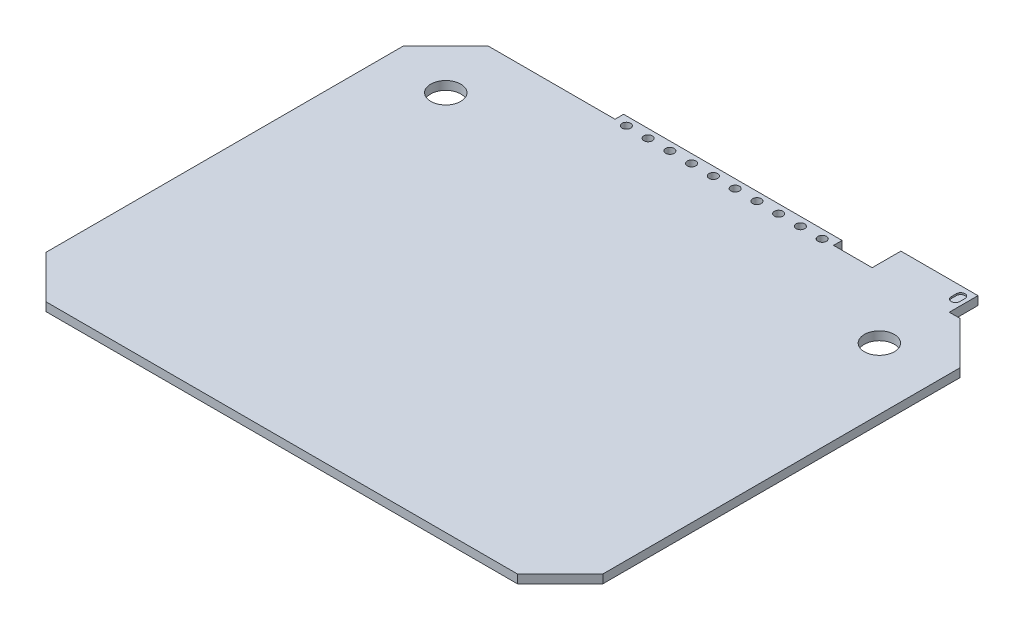
ISO-10303-21;
HEADER;
FILE_DESCRIPTION(('STEP AP214'),'2;1');
FILE_NAME('part.step','',(''),(''),'','','');
FILE_SCHEMA(('AUTOMOTIVE_DESIGN { 1 0 10303 214 1 1 1 1 }'));
ENDSEC;
DATA;
#1=APPLICATION_CONTEXT('core data for automotive mechanical design processes');
#2=APPLICATION_PROTOCOL_DEFINITION('international standard','automotive_design',2000,#1);
#3=PRODUCT_CONTEXT('',#1,'mechanical');
#4=PRODUCT('Part','Part','',(#3));
#5=PRODUCT_RELATED_PRODUCT_CATEGORY('part','',(#4));
#6=PRODUCT_DEFINITION_FORMATION('','',#4);
#7=PRODUCT_DEFINITION_CONTEXT('part definition',#1,'design');
#8=PRODUCT_DEFINITION('design','',#6,#7);
#9=PRODUCT_DEFINITION_SHAPE('','',#8);
#10=(LENGTH_UNIT() NAMED_UNIT(*) SI_UNIT(.MILLI.,.METRE.));
#11=(NAMED_UNIT(*) PLANE_ANGLE_UNIT() SI_UNIT($,.RADIAN.));
#12=(NAMED_UNIT(*) SI_UNIT($,.STERADIAN.) SOLID_ANGLE_UNIT());
#13=UNCERTAINTY_MEASURE_WITH_UNIT(LENGTH_MEASURE(1.E-05),#10,'distance_accuracy_value','');
#14=(GEOMETRIC_REPRESENTATION_CONTEXT(3) GLOBAL_UNCERTAINTY_ASSIGNED_CONTEXT((#13)) GLOBAL_UNIT_ASSIGNED_CONTEXT((#10,
#11,#12)) REPRESENTATION_CONTEXT('',''));
#15=CARTESIAN_POINT('',(0.,0.,0.));
#16=DIRECTION('',(0.,0.,1.));
#17=DIRECTION('',(1.,0.,0.));
#18=AXIS2_PLACEMENT_3D('',#15,#16,#17);
#19=CARTESIAN_POINT('',(-32.5,1.,-25.825));
#20=DIRECTION('',(0.,0.,1.));
#21=DIRECTION('',(1.,0.,0.));
#22=AXIS2_PLACEMENT_3D('',#19,#20,#21);
#23=PLANE('',#22);
#24=DIRECTION('',(-1.,0.,0.));
#25=VECTOR('',#24,1.);
#26=CARTESIAN_POINT('',(-32.5,1.,-25.825));
#27=LINE('',#26,#25);
#28=CARTESIAN_POINT('',(17.26,1.,-25.825));
#29=VERTEX_POINT('',#28);
#30=CARTESIAN_POINT('',(12.75,1.,-25.825));
#31=VERTEX_POINT('',#30);
#32=EDGE_CURVE('E49',#29,#31,#27,.T.);
#33=ORIENTED_EDGE('',*,*,#32,.F.);
#34=DIRECTION('',(0.,1.,0.));
#35=VECTOR('',#34,1.);
#36=CARTESIAN_POINT('',(17.26,-9.60325465662553,-25.825));
#37=LINE('',#36,#35);
#38=CARTESIAN_POINT('',(17.26,0.,-25.825));
#39=VERTEX_POINT('',#38);
#40=EDGE_CURVE('E240',#39,#29,#37,.T.);
#41=ORIENTED_EDGE('',*,*,#40,.F.);
#42=DIRECTION('',(-1.,0.,0.));
#43=VECTOR('',#42,1.);
#44=CARTESIAN_POINT('',(-32.5,0.,-25.825));
#45=LINE('',#44,#43);
#46=CARTESIAN_POINT('',(12.75,0.,-25.825));
#47=VERTEX_POINT('',#46);
#48=EDGE_CURVE('E333',#39,#47,#45,.T.);
#49=ORIENTED_EDGE('',*,*,#48,.T.);
#50=DIRECTION('',(0.,1.,0.));
#51=VECTOR('',#50,1.);
#52=CARTESIAN_POINT('',(12.75,-25.5196003103497,-25.825));
#53=LINE('',#52,#51);
#54=EDGE_CURVE('E320',#47,#31,#53,.T.);
#55=ORIENTED_EDGE('',*,*,#54,.T.);
#56=EDGE_LOOP('',(#33,#41,#49,#55));
#57=FACE_BOUND('',#56,.T.);
#58=ADVANCED_FACE('F45',(#57),#23,.F.);
#59=DIRECTION('',(0.,1.,0.));
#60=VECTOR('',#59,1.);
#61=CARTESIAN_POINT('',(-12.75,-25.5196003103497,-25.825));
#62=LINE('',#61,#60);
#63=CARTESIAN_POINT('',(-12.75,0.,-25.825));
#64=VERTEX_POINT('',#63);
#65=CARTESIAN_POINT('',(-12.75,1.,-25.825));
#66=VERTEX_POINT('',#65);
#67=EDGE_CURVE('E314',#64,#66,#62,.T.);
#68=ORIENTED_EDGE('',*,*,#67,.F.);
#69=CARTESIAN_POINT('',(-27.5,0.,-25.825));
#70=VERTEX_POINT('',#69);
#71=EDGE_CURVE('E336',#64,#70,#45,.T.);
#72=ORIENTED_EDGE('',*,*,#71,.T.);
#73=DIRECTION('',(0.,1.,0.));
#74=VECTOR('',#73,1.);
#75=CARTESIAN_POINT('',(-27.5,1.,-25.825));
#76=LINE('',#75,#74);
#77=CARTESIAN_POINT('',(-27.5,1.,-25.825));
#78=VERTEX_POINT('',#77);
#79=EDGE_CURVE('E366',#70,#78,#76,.T.);
#80=ORIENTED_EDGE('',*,*,#79,.T.);
#81=EDGE_CURVE('E394',#66,#78,#27,.T.);
#82=ORIENTED_EDGE('',*,*,#81,.F.);
#83=EDGE_LOOP('',(#68,#72,#80,#82));
#84=FACE_BOUND('',#83,.T.);
#85=ADVANCED_FACE('F417',(#84),#23,.F.);
#86=CARTESIAN_POINT('',(0.,1.,0.));
#87=DIRECTION('',(0.,1.,0.));
#88=DIRECTION('',(0.,0.,1.));
#89=AXIS2_PLACEMENT_3D('',#86,#87,#88);
#90=PLANE('',#89);
#91=CARTESIAN_POINT('',(25.3,1.,-28.115));
#92=DIRECTION('',(0.,1.,0.));
#93=DIRECTION('',(0.,0.,1.));
#94=AXIS2_PLACEMENT_3D('',#91,#92,#93);
#95=CIRCLE('',#94,0.5);
#96=CARTESIAN_POINT('',(25.8,1.,-28.115));
#97=VERTEX_POINT('',#96);
#98=CARTESIAN_POINT('',(24.8,1.,-28.115));
#99=VERTEX_POINT('',#98);
#100=EDGE_CURVE('E63',#97,#99,#95,.T.);
#101=ORIENTED_EDGE('',*,*,#100,.F.);
#102=DIRECTION('',(0.,0.,-1.));
#103=VECTOR('',#102,1.);
#104=CARTESIAN_POINT('',(25.8,1.,-28.115));
#105=LINE('',#104,#103);
#106=CARTESIAN_POINT('',(25.8,1.,-27.515));
#107=VERTEX_POINT('',#106);
#108=EDGE_CURVE('E204',#107,#97,#105,.T.);
#109=ORIENTED_EDGE('',*,*,#108,.F.);
#110=CARTESIAN_POINT('',(25.3,1.,-27.515));
#111=DIRECTION('',(0.,1.,0.));
#112=DIRECTION('',(0.,0.,1.));
#113=AXIS2_PLACEMENT_3D('',#110,#111,#112);
#114=CIRCLE('',#113,0.5);
#115=CARTESIAN_POINT('',(24.8,1.,-27.515));
#116=VERTEX_POINT('',#115);
#117=EDGE_CURVE('E207',#116,#107,#114,.T.);
#118=ORIENTED_EDGE('',*,*,#117,.F.);
#119=DIRECTION('',(0.,0.,1.));
#120=VECTOR('',#119,1.);
#121=CARTESIAN_POINT('',(24.8,1.,-28.115));
#122=LINE('',#121,#120);
#123=EDGE_CURVE('E213',#99,#116,#122,.T.);
#124=ORIENTED_EDGE('',*,*,#123,.F.);
#125=EDGE_LOOP('',(#101,#109,#118,#124));
#126=FACE_BOUND('',#125,.T.);
#127=CARTESIAN_POINT('',(11.43,1.,-25.825));
#128=DIRECTION('',(0.,1.,0.));
#129=DIRECTION('',(0.,0.,1.));
#130=AXIS2_PLACEMENT_3D('',#127,#128,#129);
#131=CIRCLE('',#130,0.5);
#132=CARTESIAN_POINT('',(11.43,1.,-25.325));
#133=VERTEX_POINT('',#132);
#134=EDGE_CURVE('E231',#133,#133,#131,.T.);
#135=ORIENTED_EDGE('',*,*,#134,.F.);
#136=EDGE_LOOP('',(#135));
#137=FACE_BOUND('',#136,.T.);
#138=CARTESIAN_POINT('',(8.89,1.,-25.825));
#139=DIRECTION('',(0.,1.,0.));
#140=DIRECTION('',(0.,0.,1.));
#141=AXIS2_PLACEMENT_3D('',#138,#139,#140);
#142=CIRCLE('',#141,0.5);
#143=CARTESIAN_POINT('',(8.89,1.,-25.325));
#144=VERTEX_POINT('',#143);
#145=EDGE_CURVE('E252',#144,#144,#142,.T.);
#146=ORIENTED_EDGE('',*,*,#145,.F.);
#147=EDGE_LOOP('',(#146));
#148=FACE_BOUND('',#147,.T.);
#149=CARTESIAN_POINT('',(6.35,1.,-25.825));
#150=DIRECTION('',(0.,1.,0.));
#151=DIRECTION('',(0.,0.,1.));
#152=AXIS2_PLACEMENT_3D('',#149,#150,#151);
#153=CIRCLE('',#152,0.5);
#154=CARTESIAN_POINT('',(6.35,1.,-25.325));
#155=VERTEX_POINT('',#154);
#156=EDGE_CURVE('E258',#155,#155,#153,.T.);
#157=ORIENTED_EDGE('',*,*,#156,.F.);
#158=EDGE_LOOP('',(#157));
#159=FACE_BOUND('',#158,.T.);
#160=CARTESIAN_POINT('',(3.81,1.,-25.825));
#161=DIRECTION('',(0.,1.,0.));
#162=DIRECTION('',(0.,0.,1.));
#163=AXIS2_PLACEMENT_3D('',#160,#161,#162);
#164=CIRCLE('',#163,0.5);
#165=CARTESIAN_POINT('',(3.81,1.,-25.325));
#166=VERTEX_POINT('',#165);
#167=EDGE_CURVE('E264',#166,#166,#164,.T.);
#168=ORIENTED_EDGE('',*,*,#167,.F.);
#169=EDGE_LOOP('',(#168));
#170=FACE_BOUND('',#169,.T.);
#171=CARTESIAN_POINT('',(1.27,1.,-25.825));
#172=DIRECTION('',(0.,1.,0.));
#173=DIRECTION('',(0.,0.,1.));
#174=AXIS2_PLACEMENT_3D('',#171,#172,#173);
#175=CIRCLE('',#174,0.5);
#176=CARTESIAN_POINT('',(1.27,1.,-25.325));
#177=VERTEX_POINT('',#176);
#178=EDGE_CURVE('E270',#177,#177,#175,.T.);
#179=ORIENTED_EDGE('',*,*,#178,.F.);
#180=EDGE_LOOP('',(#179));
#181=FACE_BOUND('',#180,.T.);
#182=CARTESIAN_POINT('',(-11.43,1.,-25.825));
#183=DIRECTION('',(0.,1.,0.));
#184=DIRECTION('',(0.,0.,1.));
#185=AXIS2_PLACEMENT_3D('',#182,#183,#184);
#186=CIRCLE('',#185,0.5);
#187=CARTESIAN_POINT('',(-11.43,1.,-25.325));
#188=VERTEX_POINT('',#187);
#189=EDGE_CURVE('E276',#188,#188,#186,.T.);
#190=ORIENTED_EDGE('',*,*,#189,.F.);
#191=EDGE_LOOP('',(#190));
#192=FACE_BOUND('',#191,.T.);
#193=CARTESIAN_POINT('',(-8.89,1.,-25.825));
#194=DIRECTION('',(0.,1.,0.));
#195=DIRECTION('',(0.,0.,1.));
#196=AXIS2_PLACEMENT_3D('',#193,#194,#195);
#197=CIRCLE('',#196,0.5);
#198=CARTESIAN_POINT('',(-8.89,1.,-25.325));
#199=VERTEX_POINT('',#198);
#200=EDGE_CURVE('E282',#199,#199,#197,.T.);
#201=ORIENTED_EDGE('',*,*,#200,.F.);
#202=EDGE_LOOP('',(#201));
#203=FACE_BOUND('',#202,.T.);
#204=CARTESIAN_POINT('',(-6.35,1.,-25.825));
#205=DIRECTION('',(0.,1.,0.));
#206=DIRECTION('',(0.,0.,1.));
#207=AXIS2_PLACEMENT_3D('',#204,#205,#206);
#208=CIRCLE('',#207,0.5);
#209=CARTESIAN_POINT('',(-6.35,1.,-25.325));
#210=VERTEX_POINT('',#209);
#211=EDGE_CURVE('E288',#210,#210,#208,.T.);
#212=ORIENTED_EDGE('',*,*,#211,.F.);
#213=EDGE_LOOP('',(#212));
#214=FACE_BOUND('',#213,.T.);
#215=CARTESIAN_POINT('',(-3.81,1.,-25.825));
#216=DIRECTION('',(0.,1.,0.));
#217=DIRECTION('',(0.,0.,1.));
#218=AXIS2_PLACEMENT_3D('',#215,#216,#217);
#219=CIRCLE('',#218,0.5);
#220=CARTESIAN_POINT('',(-3.81,1.,-25.325));
#221=VERTEX_POINT('',#220);
#222=EDGE_CURVE('E294',#221,#221,#219,.T.);
#223=ORIENTED_EDGE('',*,*,#222,.F.);
#224=EDGE_LOOP('',(#223));
#225=FACE_BOUND('',#224,.T.);
#226=CARTESIAN_POINT('',(-1.27,1.,-25.825));
#227=DIRECTION('',(0.,1.,0.));
#228=DIRECTION('',(0.,0.,1.));
#229=AXIS2_PLACEMENT_3D('',#226,#227,#228);
#230=CIRCLE('',#229,0.5);
#231=CARTESIAN_POINT('',(-1.27,1.,-25.325));
#232=VERTEX_POINT('',#231);
#233=EDGE_CURVE('E300',#232,#232,#230,.T.);
#234=ORIENTED_EDGE('',*,*,#233,.F.);
#235=EDGE_LOOP('',(#234));
#236=FACE_BOUND('',#235,.T.);
#237=CARTESIAN_POINT('',(-25.3,1.,-18.625));
#238=DIRECTION('',(0.,1.,0.));
#239=DIRECTION('',(0.,0.,1.));
#240=AXIS2_PLACEMENT_3D('',#237,#238,#239);
#241=CIRCLE('',#240,1.75);
#242=CARTESIAN_POINT('',(-25.3,1.,-16.875));
#243=VERTEX_POINT('',#242);
#244=EDGE_CURVE('E406',#243,#243,#241,.T.);
#245=ORIENTED_EDGE('',*,*,#244,.F.);
#246=EDGE_LOOP('',(#245));
#247=FACE_BOUND('',#246,.T.);
#248=CARTESIAN_POINT('',(27.5,1.,-25.825));
#249=VERTEX_POINT('',#248);
#250=CARTESIAN_POINT('',(26.26,1.,-25.825));
#251=VERTEX_POINT('',#250);
#252=EDGE_CURVE('E387',#249,#251,#27,.T.);
#253=ORIENTED_EDGE('',*,*,#252,.T.);
#254=DIRECTION('',(0.,0.,-1.));
#255=VECTOR('',#254,1.);
#256=CARTESIAN_POINT('',(26.26,1.,-29.175));
#257=LINE('',#256,#255);
#258=CARTESIAN_POINT('',(26.26,1.,-29.175));
#259=VERTEX_POINT('',#258);
#260=EDGE_CURVE('E234',#251,#259,#257,.T.);
#261=ORIENTED_EDGE('',*,*,#260,.T.);
#262=DIRECTION('',(-1.,0.,0.));
#263=VECTOR('',#262,1.);
#264=CARTESIAN_POINT('',(17.26,1.,-29.175));
#265=LINE('',#264,#263);
#266=CARTESIAN_POINT('',(17.26,1.,-29.175));
#267=VERTEX_POINT('',#266);
#268=EDGE_CURVE('E237',#259,#267,#265,.T.);
#269=ORIENTED_EDGE('',*,*,#268,.T.);
#270=DIRECTION('',(0.,0.,1.));
#271=VECTOR('',#270,1.);
#272=CARTESIAN_POINT('',(17.26,1.,-29.175));
#273=LINE('',#272,#271);
#274=EDGE_CURVE('E219',#267,#29,#273,.T.);
#275=ORIENTED_EDGE('',*,*,#274,.T.);
#276=ORIENTED_EDGE('',*,*,#32,.T.);
#277=DIRECTION('',(0.,0.,-1.));
#278=VECTOR('',#277,1.);
#279=CARTESIAN_POINT('',(12.75,1.,-26.825));
#280=LINE('',#279,#278);
#281=CARTESIAN_POINT('',(12.75,1.,-26.825));
#282=VERTEX_POINT('',#281);
#283=EDGE_CURVE('E315',#31,#282,#280,.T.);
#284=ORIENTED_EDGE('',*,*,#283,.T.);
#285=DIRECTION('',(-1.,0.,0.));
#286=VECTOR('',#285,1.);
#287=CARTESIAN_POINT('',(-12.75,1.,-26.825));
#288=LINE('',#287,#286);
#289=CARTESIAN_POINT('',(-12.75,1.,-26.825));
#290=VERTEX_POINT('',#289);
#291=EDGE_CURVE('E311',#282,#290,#288,.T.);
#292=ORIENTED_EDGE('',*,*,#291,.T.);
#293=DIRECTION('',(0.,0.,1.));
#294=VECTOR('',#293,1.);
#295=CARTESIAN_POINT('',(-12.75,1.,-26.825));
#296=LINE('',#295,#294);
#297=EDGE_CURVE('E306',#290,#66,#296,.T.);
#298=ORIENTED_EDGE('',*,*,#297,.T.);
#299=ORIENTED_EDGE('',*,*,#81,.T.);
#300=DIRECTION('',(0.707106781186548,0.,-0.707106781186547));
#301=VECTOR('',#300,1.);
#302=CARTESIAN_POINT('',(-26.6625,1.,-26.6625));
#303=LINE('',#302,#301);
#304=CARTESIAN_POINT('',(-32.5,1.,-20.825));
#305=VERTEX_POINT('',#304);
#306=EDGE_CURVE('E358',#78,#305,#303,.F.);
#307=ORIENTED_EDGE('',*,*,#306,.T.);
#308=DIRECTION('',(0.,0.,1.));
#309=VECTOR('',#308,1.);
#310=CARTESIAN_POINT('',(-32.5,1.,-25.825));
#311=LINE('',#310,#309);
#312=CARTESIAN_POINT('',(-32.5,1.,20.8249999999999));
#313=VERTEX_POINT('',#312);
#314=EDGE_CURVE('E349',#305,#313,#311,.T.);
#315=ORIENTED_EDGE('',*,*,#314,.T.);
#316=DIRECTION('',(-0.707106781186546,0.,-0.70710678118655));
#317=VECTOR('',#316,1.);
#318=CARTESIAN_POINT('',(-26.6625000000001,1.,26.6624999999999));
#319=LINE('',#318,#317);
#320=CARTESIAN_POINT('',(-27.5,1.,25.825));
#321=VERTEX_POINT('',#320);
#322=EDGE_CURVE('E360',#313,#321,#319,.F.);
#323=ORIENTED_EDGE('',*,*,#322,.T.);
#324=DIRECTION('',(1.,0.,0.));
#325=VECTOR('',#324,1.);
#326=CARTESIAN_POINT('',(-32.5,1.,25.825));
#327=LINE('',#326,#325);
#328=CARTESIAN_POINT('',(27.5,1.,25.825));
#329=VERTEX_POINT('',#328);
#330=EDGE_CURVE('E432',#321,#329,#327,.T.);
#331=ORIENTED_EDGE('',*,*,#330,.T.);
#332=DIRECTION('',(-0.707106781186548,0.,0.707106781186547));
#333=VECTOR('',#332,1.);
#334=CARTESIAN_POINT('',(26.6625,1.,26.6625));
#335=LINE('',#334,#333);
#336=CARTESIAN_POINT('',(32.5,1.,20.825));
#337=VERTEX_POINT('',#336);
#338=EDGE_CURVE('E364',#329,#337,#335,.F.);
#339=ORIENTED_EDGE('',*,*,#338,.T.);
#340=DIRECTION('',(0.,0.,-1.));
#341=VECTOR('',#340,1.);
#342=CARTESIAN_POINT('',(32.5,1.,-25.825));
#343=LINE('',#342,#341);
#344=CARTESIAN_POINT('',(32.5,1.,-20.825));
#345=VERTEX_POINT('',#344);
#346=EDGE_CURVE('E400',#337,#345,#343,.T.);
#347=ORIENTED_EDGE('',*,*,#346,.T.);
#348=DIRECTION('',(0.707106781186546,0.,0.70710678118655));
#349=VECTOR('',#348,1.);
#350=CARTESIAN_POINT('',(26.6625000000001,1.,-26.6624999999999));
#351=LINE('',#350,#349);
#352=EDGE_CURVE('E362',#345,#249,#351,.F.);
#353=ORIENTED_EDGE('',*,*,#352,.T.);
#354=EDGE_LOOP('',(#253,#261,#269,#275,#276,#284,#292,#298,#299,#307,#315,#323,#331,#339,#347,#353));
#355=FACE_BOUND('',#354,.T.);
#356=CARTESIAN_POINT('',(25.3,1.,-18.625));
#357=DIRECTION('',(0.,1.,0.));
#358=DIRECTION('',(0.,0.,1.));
#359=AXIS2_PLACEMENT_3D('',#356,#357,#358);
#360=CIRCLE('',#359,1.75);
#361=CARTESIAN_POINT('',(25.3,1.,-16.875));
#362=VERTEX_POINT('',#361);
#363=EDGE_CURVE('E441',#362,#362,#360,.T.);
#364=ORIENTED_EDGE('',*,*,#363,.F.);
#365=EDGE_LOOP('',(#364));
#366=FACE_BOUND('',#365,.T.);
#367=ADVANCED_FACE('F427',(#126,#137,#148,#159,#170,#181,#192,#203,#214,#225,#236,#247,#355,
#366),#90,.T.);
#368=CARTESIAN_POINT('',(0.,0.,0.));
#369=DIRECTION('',(0.,1.,0.));
#370=DIRECTION('',(0.,0.,1.));
#371=AXIS2_PLACEMENT_3D('',#368,#369,#370);
#372=PLANE('',#371);
#373=CARTESIAN_POINT('',(11.43,0.,-25.825));
#374=DIRECTION('',(0.,1.,0.));
#375=DIRECTION('',(0.,0.,1.));
#376=AXIS2_PLACEMENT_3D('',#373,#374,#375);
#377=CIRCLE('',#376,0.5);
#378=CARTESIAN_POINT('',(11.43,0.,-25.325));
#379=VERTEX_POINT('',#378);
#380=EDGE_CURVE('E249',#379,#379,#377,.F.);
#381=ORIENTED_EDGE('',*,*,#380,.F.);
#382=EDGE_LOOP('',(#381));
#383=FACE_BOUND('',#382,.T.);
#384=CARTESIAN_POINT('',(8.89,0.,-25.825));
#385=DIRECTION('',(0.,1.,0.));
#386=DIRECTION('',(0.,0.,1.));
#387=AXIS2_PLACEMENT_3D('',#384,#385,#386);
#388=CIRCLE('',#387,0.5);
#389=CARTESIAN_POINT('',(8.89,0.,-25.325));
#390=VERTEX_POINT('',#389);
#391=EDGE_CURVE('E255',#390,#390,#388,.F.);
#392=ORIENTED_EDGE('',*,*,#391,.F.);
#393=EDGE_LOOP('',(#392));
#394=FACE_BOUND('',#393,.T.);
#395=CARTESIAN_POINT('',(6.35,0.,-25.825));
#396=DIRECTION('',(0.,1.,0.));
#397=DIRECTION('',(0.,0.,1.));
#398=AXIS2_PLACEMENT_3D('',#395,#396,#397);
#399=CIRCLE('',#398,0.5);
#400=CARTESIAN_POINT('',(6.35,0.,-25.325));
#401=VERTEX_POINT('',#400);
#402=EDGE_CURVE('E261',#401,#401,#399,.F.);
#403=ORIENTED_EDGE('',*,*,#402,.F.);
#404=EDGE_LOOP('',(#403));
#405=FACE_BOUND('',#404,.T.);
#406=CARTESIAN_POINT('',(3.81,0.,-25.825));
#407=DIRECTION('',(0.,1.,0.));
#408=DIRECTION('',(0.,0.,1.));
#409=AXIS2_PLACEMENT_3D('',#406,#407,#408);
#410=CIRCLE('',#409,0.5);
#411=CARTESIAN_POINT('',(3.81,0.,-25.325));
#412=VERTEX_POINT('',#411);
#413=EDGE_CURVE('E267',#412,#412,#410,.F.);
#414=ORIENTED_EDGE('',*,*,#413,.F.);
#415=EDGE_LOOP('',(#414));
#416=FACE_BOUND('',#415,.T.);
#417=CARTESIAN_POINT('',(1.27,0.,-25.825));
#418=DIRECTION('',(0.,1.,0.));
#419=DIRECTION('',(0.,0.,1.));
#420=AXIS2_PLACEMENT_3D('',#417,#418,#419);
#421=CIRCLE('',#420,0.5);
#422=CARTESIAN_POINT('',(1.27,0.,-25.325));
#423=VERTEX_POINT('',#422);
#424=EDGE_CURVE('E273',#423,#423,#421,.F.);
#425=ORIENTED_EDGE('',*,*,#424,.F.);
#426=EDGE_LOOP('',(#425));
#427=FACE_BOUND('',#426,.T.);
#428=CARTESIAN_POINT('',(-11.43,0.,-25.825));
#429=DIRECTION('',(0.,1.,0.));
#430=DIRECTION('',(0.,0.,1.));
#431=AXIS2_PLACEMENT_3D('',#428,#429,#430);
#432=CIRCLE('',#431,0.5);
#433=CARTESIAN_POINT('',(-11.43,0.,-25.325));
#434=VERTEX_POINT('',#433);
#435=EDGE_CURVE('E279',#434,#434,#432,.F.);
#436=ORIENTED_EDGE('',*,*,#435,.F.);
#437=EDGE_LOOP('',(#436));
#438=FACE_BOUND('',#437,.T.);
#439=CARTESIAN_POINT('',(-8.89,0.,-25.825));
#440=DIRECTION('',(0.,1.,0.));
#441=DIRECTION('',(0.,0.,1.));
#442=AXIS2_PLACEMENT_3D('',#439,#440,#441);
#443=CIRCLE('',#442,0.5);
#444=CARTESIAN_POINT('',(-8.89,0.,-25.325));
#445=VERTEX_POINT('',#444);
#446=EDGE_CURVE('E285',#445,#445,#443,.F.);
#447=ORIENTED_EDGE('',*,*,#446,.F.);
#448=EDGE_LOOP('',(#447));
#449=FACE_BOUND('',#448,.T.);
#450=CARTESIAN_POINT('',(-6.35,0.,-25.825));
#451=DIRECTION('',(0.,1.,0.));
#452=DIRECTION('',(0.,0.,1.));
#453=AXIS2_PLACEMENT_3D('',#450,#451,#452);
#454=CIRCLE('',#453,0.5);
#455=CARTESIAN_POINT('',(-6.35,0.,-25.325));
#456=VERTEX_POINT('',#455);
#457=EDGE_CURVE('E291',#456,#456,#454,.F.);
#458=ORIENTED_EDGE('',*,*,#457,.F.);
#459=EDGE_LOOP('',(#458));
#460=FACE_BOUND('',#459,.T.);
#461=CARTESIAN_POINT('',(-3.81,0.,-25.825));
#462=DIRECTION('',(0.,1.,0.));
#463=DIRECTION('',(0.,0.,1.));
#464=AXIS2_PLACEMENT_3D('',#461,#462,#463);
#465=CIRCLE('',#464,0.5);
#466=CARTESIAN_POINT('',(-3.81,0.,-25.325));
#467=VERTEX_POINT('',#466);
#468=EDGE_CURVE('E297',#467,#467,#465,.F.);
#469=ORIENTED_EDGE('',*,*,#468,.F.);
#470=EDGE_LOOP('',(#469));
#471=FACE_BOUND('',#470,.T.);
#472=CARTESIAN_POINT('',(-1.27,0.,-25.825));
#473=DIRECTION('',(0.,1.,0.));
#474=DIRECTION('',(0.,0.,1.));
#475=AXIS2_PLACEMENT_3D('',#472,#473,#474);
#476=CIRCLE('',#475,0.5);
#477=CARTESIAN_POINT('',(-1.27,0.,-25.325));
#478=VERTEX_POINT('',#477);
#479=EDGE_CURVE('E303',#478,#478,#476,.F.);
#480=ORIENTED_EDGE('',*,*,#479,.F.);
#481=EDGE_LOOP('',(#480));
#482=FACE_BOUND('',#481,.T.);
#483=CARTESIAN_POINT('',(-25.3,0.,-18.625));
#484=DIRECTION('',(0.,1.,0.));
#485=DIRECTION('',(0.,0.,1.));
#486=AXIS2_PLACEMENT_3D('',#483,#484,#485);
#487=CIRCLE('',#486,1.75);
#488=CARTESIAN_POINT('',(-25.3,0.,-16.875));
#489=VERTEX_POINT('',#488);
#490=EDGE_CURVE('E438',#489,#489,#487,.T.);
#491=ORIENTED_EDGE('',*,*,#490,.T.);
#492=EDGE_LOOP('',(#491));
#493=FACE_BOUND('',#492,.T.);
#494=DIRECTION('',(0.,0.,1.));
#495=VECTOR('',#494,1.);
#496=CARTESIAN_POINT('',(-32.5,0.,-25.825));
#497=LINE('',#496,#495);
#498=CARTESIAN_POINT('',(-32.5,0.,-20.825));
#499=VERTEX_POINT('',#498);
#500=CARTESIAN_POINT('',(-32.5,0.,20.825));
#501=VERTEX_POINT('',#500);
#502=EDGE_CURVE('E402',#499,#501,#497,.T.);
#503=ORIENTED_EDGE('',*,*,#502,.F.);
#504=DIRECTION('',(-0.707106781186548,0.,0.707106781186547));
#505=VECTOR('',#504,1.);
#506=CARTESIAN_POINT('',(-32.5,0.,-20.825));
#507=LINE('',#506,#505);
#508=EDGE_CURVE('E372',#499,#70,#507,.F.);
#509=ORIENTED_EDGE('',*,*,#508,.T.);
#510=ORIENTED_EDGE('',*,*,#71,.F.);
#511=DIRECTION('',(0.,0.,-1.));
#512=VECTOR('',#511,1.);
#513=CARTESIAN_POINT('',(-12.75,0.,-26.825));
#514=LINE('',#513,#512);
#515=CARTESIAN_POINT('',(-12.75,0.,-26.825));
#516=VERTEX_POINT('',#515);
#517=EDGE_CURVE('E309',#64,#516,#514,.T.);
#518=ORIENTED_EDGE('',*,*,#517,.T.);
#519=DIRECTION('',(1.,0.,0.));
#520=VECTOR('',#519,1.);
#521=CARTESIAN_POINT('',(-12.75,0.,-26.825));
#522=LINE('',#521,#520);
#523=CARTESIAN_POINT('',(12.75,0.,-26.825));
#524=VERTEX_POINT('',#523);
#525=EDGE_CURVE('E307',#516,#524,#522,.T.);
#526=ORIENTED_EDGE('',*,*,#525,.T.);
#527=DIRECTION('',(0.,0.,1.));
#528=VECTOR('',#527,1.);
#529=CARTESIAN_POINT('',(12.75,0.,-26.825));
#530=LINE('',#529,#528);
#531=EDGE_CURVE('E310',#524,#47,#530,.T.);
#532=ORIENTED_EDGE('',*,*,#531,.T.);
#533=ORIENTED_EDGE('',*,*,#48,.F.);
#534=DIRECTION('',(0.,0.,-1.));
#535=VECTOR('',#534,1.);
#536=CARTESIAN_POINT('',(17.26,0.,-29.175));
#537=LINE('',#536,#535);
#538=CARTESIAN_POINT('',(17.26,0.,-29.175));
#539=VERTEX_POINT('',#538);
#540=EDGE_CURVE('E229',#39,#539,#537,.T.);
#541=ORIENTED_EDGE('',*,*,#540,.T.);
#542=DIRECTION('',(1.,0.,0.));
#543=VECTOR('',#542,1.);
#544=CARTESIAN_POINT('',(17.26,0.,-29.175));
#545=LINE('',#544,#543);
#546=CARTESIAN_POINT('',(26.26,0.,-29.175));
#547=VERTEX_POINT('',#546);
#548=EDGE_CURVE('E226',#539,#547,#545,.T.);
#549=ORIENTED_EDGE('',*,*,#548,.T.);
#550=DIRECTION('',(0.,0.,1.));
#551=VECTOR('',#550,1.);
#552=CARTESIAN_POINT('',(26.26,0.,-29.175));
#553=LINE('',#552,#551);
#554=CARTESIAN_POINT('',(26.26,0.,-25.825));
#555=VERTEX_POINT('',#554);
#556=EDGE_CURVE('E223',#547,#555,#553,.T.);
#557=ORIENTED_EDGE('',*,*,#556,.T.);
#558=CARTESIAN_POINT('',(27.5,0.,-25.825));
#559=VERTEX_POINT('',#558);
#560=EDGE_CURVE('E335',#559,#555,#45,.T.);
#561=ORIENTED_EDGE('',*,*,#560,.F.);
#562=DIRECTION('',(-0.707106781186546,0.,-0.70710678118655));
#563=VECTOR('',#562,1.);
#564=CARTESIAN_POINT('',(27.5,0.,-25.825));
#565=LINE('',#564,#563);
#566=CARTESIAN_POINT('',(32.5,0.,-20.825));
#567=VERTEX_POINT('',#566);
#568=EDGE_CURVE('E377',#559,#567,#565,.F.);
#569=ORIENTED_EDGE('',*,*,#568,.T.);
#570=DIRECTION('',(0.,0.,-1.));
#571=VECTOR('',#570,1.);
#572=CARTESIAN_POINT('',(32.5,0.,-25.825));
#573=LINE('',#572,#571);
#574=CARTESIAN_POINT('',(32.5,0.,20.825));
#575=VERTEX_POINT('',#574);
#576=EDGE_CURVE('E340',#575,#567,#573,.T.);
#577=ORIENTED_EDGE('',*,*,#576,.F.);
#578=DIRECTION('',(0.707106781186548,0.,-0.707106781186547));
#579=VECTOR('',#578,1.);
#580=CARTESIAN_POINT('',(32.5,0.,20.825));
#581=LINE('',#580,#579);
#582=CARTESIAN_POINT('',(27.5,0.,25.825));
#583=VERTEX_POINT('',#582);
#584=EDGE_CURVE('E379',#575,#583,#581,.F.);
#585=ORIENTED_EDGE('',*,*,#584,.T.);
#586=DIRECTION('',(1.,0.,0.));
#587=VECTOR('',#586,1.);
#588=CARTESIAN_POINT('',(-32.5,0.,25.825));
#589=LINE('',#588,#587);
#590=CARTESIAN_POINT('',(-27.5,0.,25.825));
#591=VERTEX_POINT('',#590);
#592=EDGE_CURVE('E405',#591,#583,#589,.T.);
#593=ORIENTED_EDGE('',*,*,#592,.F.);
#594=DIRECTION('',(0.707106781186546,0.,0.70710678118655));
#595=VECTOR('',#594,1.);
#596=CARTESIAN_POINT('',(-27.5,0.,25.825));
#597=LINE('',#596,#595);
#598=EDGE_CURVE('E375',#591,#501,#597,.F.);
#599=ORIENTED_EDGE('',*,*,#598,.T.);
#600=EDGE_LOOP('',(#503,#509,#510,#518,#526,#532,#533,#541,#549,#557,#561,#569,#577,#585,#593,#599));
#601=FACE_BOUND('',#600,.T.);
#602=CARTESIAN_POINT('',(25.3,0.,-18.625));
#603=DIRECTION('',(0.,1.,0.));
#604=DIRECTION('',(0.,0.,1.));
#605=AXIS2_PLACEMENT_3D('',#602,#603,#604);
#606=CIRCLE('',#605,1.75);
#607=CARTESIAN_POINT('',(25.3,0.,-16.875));
#608=VERTEX_POINT('',#607);
#609=EDGE_CURVE('E443',#608,#608,#606,.T.);
#610=ORIENTED_EDGE('',*,*,#609,.T.);
#611=EDGE_LOOP('',(#610));
#612=FACE_BOUND('',#611,.T.);
#613=ADVANCED_FACE('F423',(#383,#394,#405,#416,#427,#438,#449,#460,#471,#482,#493,#601,#612),
#372,.F.);
#614=CARTESIAN_POINT('',(-32.5,1.,-25.825));
#615=DIRECTION('',(1.,0.,0.));
#616=DIRECTION('',(0.,0.,-1.));
#617=AXIS2_PLACEMENT_3D('',#614,#615,#616);
#618=PLANE('',#617);
#619=ORIENTED_EDGE('',*,*,#314,.F.);
#620=DIRECTION('',(0.,-1.,0.));
#621=VECTOR('',#620,1.);
#622=CARTESIAN_POINT('',(-32.5,1.,-20.825));
#623=LINE('',#622,#621);
#624=EDGE_CURVE('E380',#305,#499,#623,.T.);
#625=ORIENTED_EDGE('',*,*,#624,.T.);
#626=ORIENTED_EDGE('',*,*,#502,.T.);
#627=DIRECTION('',(0.,1.,0.));
#628=VECTOR('',#627,1.);
#629=CARTESIAN_POINT('',(-32.5,1.,20.825));
#630=LINE('',#629,#628);
#631=EDGE_CURVE('E342',#501,#313,#630,.T.);
#632=ORIENTED_EDGE('',*,*,#631,.T.);
#633=EDGE_LOOP('',(#619,#625,#626,#632));
#634=FACE_BOUND('',#633,.T.);
#635=ADVANCED_FACE('F431',(#634),#618,.F.);
#636=CARTESIAN_POINT('',(-32.5,1.,25.825));
#637=DIRECTION('',(0.,0.,-1.));
#638=DIRECTION('',(-1.,0.,0.));
#639=AXIS2_PLACEMENT_3D('',#636,#637,#638);
#640=PLANE('',#639);
#641=ORIENTED_EDGE('',*,*,#330,.F.);
#642=DIRECTION('',(0.,-1.,0.));
#643=VECTOR('',#642,1.);
#644=CARTESIAN_POINT('',(-27.5,1.,25.825));
#645=LINE('',#644,#643);
#646=EDGE_CURVE('E353',#321,#591,#645,.T.);
#647=ORIENTED_EDGE('',*,*,#646,.T.);
#648=ORIENTED_EDGE('',*,*,#592,.T.);
#649=DIRECTION('',(0.,1.,0.));
#650=VECTOR('',#649,1.);
#651=CARTESIAN_POINT('',(27.5,1.,25.825));
#652=LINE('',#651,#650);
#653=EDGE_CURVE('E356',#583,#329,#652,.T.);
#654=ORIENTED_EDGE('',*,*,#653,.T.);
#655=EDGE_LOOP('',(#641,#647,#648,#654));
#656=FACE_BOUND('',#655,.T.);
#657=ADVANCED_FACE('F510',(#656),#640,.F.);
#658=CARTESIAN_POINT('',(32.5,1.,-25.825));
#659=DIRECTION('',(-1.,0.,0.));
#660=DIRECTION('',(0.,0.,1.));
#661=AXIS2_PLACEMENT_3D('',#658,#659,#660);
#662=PLANE('',#661);
#663=ORIENTED_EDGE('',*,*,#576,.T.);
#664=DIRECTION('',(0.,1.,0.));
#665=VECTOR('',#664,1.);
#666=CARTESIAN_POINT('',(32.5,1.,-20.825));
#667=LINE('',#666,#665);
#668=EDGE_CURVE('E13',#567,#345,#667,.T.);
#669=ORIENTED_EDGE('',*,*,#668,.T.);
#670=ORIENTED_EDGE('',*,*,#346,.F.);
#671=DIRECTION('',(0.,-1.,0.));
#672=VECTOR('',#671,1.);
#673=CARTESIAN_POINT('',(32.5,1.,20.825));
#674=LINE('',#673,#672);
#675=EDGE_CURVE('E55',#337,#575,#674,.T.);
#676=ORIENTED_EDGE('',*,*,#675,.T.);
#677=EDGE_LOOP('',(#663,#669,#670,#676));
#678=FACE_BOUND('',#677,.T.);
#679=ADVANCED_FACE('F502',(#678),#662,.F.);
#680=ORIENTED_EDGE('',*,*,#560,.T.);
#681=DIRECTION('',(0.,1.,0.));
#682=VECTOR('',#681,1.);
#683=CARTESIAN_POINT('',(26.26,-9.60325465662553,-25.825));
#684=LINE('',#683,#682);
#685=EDGE_CURVE('E244',#555,#251,#684,.T.);
#686=ORIENTED_EDGE('',*,*,#685,.T.);
#687=ORIENTED_EDGE('',*,*,#252,.F.);
#688=DIRECTION('',(0.,-1.,0.));
#689=VECTOR('',#688,1.);
#690=CARTESIAN_POINT('',(27.5,1.,-25.825));
#691=LINE('',#690,#689);
#692=EDGE_CURVE('E369',#249,#559,#691,.T.);
#693=ORIENTED_EDGE('',*,*,#692,.T.);
#694=EDGE_LOOP('',(#680,#686,#687,#693));
#695=FACE_BOUND('',#694,.T.);
#696=ADVANCED_FACE('F495',(#695),#23,.F.);
#697=CARTESIAN_POINT('',(-32.5,1.,-20.825));
#698=DIRECTION('',(0.707106781186547,0.,0.707106781186548));
#699=DIRECTION('',(0.,-1.,0.));
#700=AXIS2_PLACEMENT_3D('',#697,#698,#699);
#701=PLANE('',#700);
#702=ORIENTED_EDGE('',*,*,#306,.F.);
#703=ORIENTED_EDGE('',*,*,#79,.F.);
#704=ORIENTED_EDGE('',*,*,#508,.F.);
#705=ORIENTED_EDGE('',*,*,#624,.F.);
#706=EDGE_LOOP('',(#702,#703,#704,#705));
#707=FACE_BOUND('',#706,.T.);
#708=ADVANCED_FACE('F426',(#707),#701,.F.);
#709=CARTESIAN_POINT('',(-27.5,1.,25.825));
#710=DIRECTION('',(0.70710678118655,0.,-0.707106781186546));
#711=DIRECTION('',(0.,-1.,0.));
#712=AXIS2_PLACEMENT_3D('',#709,#710,#711);
#713=PLANE('',#712);
#714=ORIENTED_EDGE('',*,*,#322,.F.);
#715=ORIENTED_EDGE('',*,*,#631,.F.);
#716=ORIENTED_EDGE('',*,*,#598,.F.);
#717=ORIENTED_EDGE('',*,*,#646,.F.);
#718=EDGE_LOOP('',(#714,#715,#716,#717));
#719=FACE_BOUND('',#718,.T.);
#720=ADVANCED_FACE('F508',(#719),#713,.F.);
#721=CARTESIAN_POINT('',(27.5,1.,-25.825));
#722=DIRECTION('',(-0.70710678118655,0.,0.707106781186546));
#723=DIRECTION('',(0.,-1.,0.));
#724=AXIS2_PLACEMENT_3D('',#721,#722,#723);
#725=PLANE('',#724);
#726=ORIENTED_EDGE('',*,*,#352,.F.);
#727=ORIENTED_EDGE('',*,*,#668,.F.);
#728=ORIENTED_EDGE('',*,*,#568,.F.);
#729=ORIENTED_EDGE('',*,*,#692,.F.);
#730=EDGE_LOOP('',(#726,#727,#728,#729));
#731=FACE_BOUND('',#730,.T.);
#732=ADVANCED_FACE('F515',(#731),#725,.F.);
#733=CARTESIAN_POINT('',(32.5,1.,20.825));
#734=DIRECTION('',(-0.707106781186547,0.,-0.707106781186548));
#735=DIRECTION('',(0.,-1.,0.));
#736=AXIS2_PLACEMENT_3D('',#733,#734,#735);
#737=PLANE('',#736);
#738=ORIENTED_EDGE('',*,*,#338,.F.);
#739=ORIENTED_EDGE('',*,*,#653,.F.);
#740=ORIENTED_EDGE('',*,*,#584,.F.);
#741=ORIENTED_EDGE('',*,*,#675,.F.);
#742=EDGE_LOOP('',(#738,#739,#740,#741));
#743=FACE_BOUND('',#742,.T.);
#744=ADVANCED_FACE('F47',(#743),#737,.F.);
#745=CARTESIAN_POINT('',(-25.3,1.001,-18.625));
#746=DIRECTION('',(0.,-1.,0.));
#747=DIRECTION('',(0.,0.,-1.));
#748=AXIS2_PLACEMENT_3D('',#745,#746,#747);
#749=CYLINDRICAL_SURFACE('',#748,1.75);
#750=ORIENTED_EDGE('',*,*,#244,.T.);
#751=EDGE_LOOP('',(#750));
#752=FACE_BOUND('',#751,.T.);
#753=ORIENTED_EDGE('',*,*,#490,.F.);
#754=EDGE_LOOP('',(#753));
#755=FACE_BOUND('',#754,.T.);
#756=ADVANCED_FACE('F489',(#752,#755),#749,.F.);
#757=CARTESIAN_POINT('',(25.3,1.001,-18.625));
#758=DIRECTION('',(0.,-1.,0.));
#759=DIRECTION('',(0.,0.,-1.));
#760=AXIS2_PLACEMENT_3D('',#757,#758,#759);
#761=CYLINDRICAL_SURFACE('',#760,1.75);
#762=ORIENTED_EDGE('',*,*,#363,.T.);
#763=EDGE_LOOP('',(#762));
#764=FACE_BOUND('',#763,.T.);
#765=ORIENTED_EDGE('',*,*,#609,.F.);
#766=EDGE_LOOP('',(#765));
#767=FACE_BOUND('',#766,.T.);
#768=ADVANCED_FACE('F482',(#764,#767),#761,.F.);
#769=CARTESIAN_POINT('',(-12.75,-25.5196003103497,-26.825));
#770=DIRECTION('',(-1.,0.,0.));
#771=DIRECTION('',(0.,0.,1.));
#772=AXIS2_PLACEMENT_3D('',#769,#770,#771);
#773=PLANE('',#772);
#774=ORIENTED_EDGE('',*,*,#517,.F.);
#775=ORIENTED_EDGE('',*,*,#67,.T.);
#776=ORIENTED_EDGE('',*,*,#297,.F.);
#777=DIRECTION('',(0.,1.,0.));
#778=VECTOR('',#777,1.);
#779=CARTESIAN_POINT('',(-12.75,-25.5196003103497,-26.825));
#780=LINE('',#779,#778);
#781=EDGE_CURVE('E316',#516,#290,#780,.T.);
#782=ORIENTED_EDGE('',*,*,#781,.F.);
#783=EDGE_LOOP('',(#774,#775,#776,#782));
#784=FACE_BOUND('',#783,.T.);
#785=ADVANCED_FACE('F480',(#784),#773,.T.);
#786=CARTESIAN_POINT('',(-12.75,-25.5196003103497,-26.825));
#787=DIRECTION('',(0.,0.,-1.));
#788=DIRECTION('',(-1.,0.,0.));
#789=AXIS2_PLACEMENT_3D('',#786,#787,#788);
#790=PLANE('',#789);
#791=ORIENTED_EDGE('',*,*,#525,.F.);
#792=ORIENTED_EDGE('',*,*,#781,.T.);
#793=ORIENTED_EDGE('',*,*,#291,.F.);
#794=DIRECTION('',(0.,1.,0.));
#795=VECTOR('',#794,1.);
#796=CARTESIAN_POINT('',(12.75,-25.5196003103497,-26.825));
#797=LINE('',#796,#795);
#798=EDGE_CURVE('E318',#524,#282,#797,.T.);
#799=ORIENTED_EDGE('',*,*,#798,.F.);
#800=EDGE_LOOP('',(#791,#792,#793,#799));
#801=FACE_BOUND('',#800,.T.);
#802=ADVANCED_FACE('F476',(#801),#790,.T.);
#803=CARTESIAN_POINT('',(12.75,-25.5196003103497,-26.825));
#804=DIRECTION('',(1.,0.,0.));
#805=DIRECTION('',(0.,0.,-1.));
#806=AXIS2_PLACEMENT_3D('',#803,#804,#805);
#807=PLANE('',#806);
#808=ORIENTED_EDGE('',*,*,#531,.F.);
#809=ORIENTED_EDGE('',*,*,#798,.T.);
#810=ORIENTED_EDGE('',*,*,#283,.F.);
#811=ORIENTED_EDGE('',*,*,#54,.F.);
#812=EDGE_LOOP('',(#808,#809,#810,#811));
#813=FACE_BOUND('',#812,.T.);
#814=ADVANCED_FACE('F459',(#813),#807,.T.);
#815=CARTESIAN_POINT('',(-1.27,-0.00105000000000005,-25.825));
#816=DIRECTION('',(0.,1.,0.));
#817=DIRECTION('',(0.,0.,1.));
#818=AXIS2_PLACEMENT_3D('',#815,#816,#817);
#819=CYLINDRICAL_SURFACE('',#818,0.5);
#820=ORIENTED_EDGE('',*,*,#233,.T.);
#821=EDGE_LOOP('',(#820));
#822=FACE_BOUND('',#821,.T.);
#823=ORIENTED_EDGE('',*,*,#479,.T.);
#824=EDGE_LOOP('',(#823));
#825=FACE_BOUND('',#824,.T.);
#826=ADVANCED_FACE('F573',(#822,#825),#819,.F.);
#827=CARTESIAN_POINT('',(-3.81,-0.00105000000000005,-25.825));
#828=DIRECTION('',(0.,1.,0.));
#829=DIRECTION('',(0.,0.,1.));
#830=AXIS2_PLACEMENT_3D('',#827,#828,#829);
#831=CYLINDRICAL_SURFACE('',#830,0.5);
#832=ORIENTED_EDGE('',*,*,#222,.T.);
#833=EDGE_LOOP('',(#832));
#834=FACE_BOUND('',#833,.T.);
#835=ORIENTED_EDGE('',*,*,#468,.T.);
#836=EDGE_LOOP('',(#835));
#837=FACE_BOUND('',#836,.T.);
#838=ADVANCED_FACE('F575',(#834,#837),#831,.F.);
#839=CARTESIAN_POINT('',(-6.35,-0.00105000000000005,-25.825));
#840=DIRECTION('',(0.,1.,0.));
#841=DIRECTION('',(0.,0.,1.));
#842=AXIS2_PLACEMENT_3D('',#839,#840,#841);
#843=CYLINDRICAL_SURFACE('',#842,0.5);
#844=ORIENTED_EDGE('',*,*,#211,.T.);
#845=EDGE_LOOP('',(#844));
#846=FACE_BOUND('',#845,.T.);
#847=ORIENTED_EDGE('',*,*,#457,.T.);
#848=EDGE_LOOP('',(#847));
#849=FACE_BOUND('',#848,.T.);
#850=ADVANCED_FACE('F582',(#846,#849),#843,.F.);
#851=CARTESIAN_POINT('',(-8.89,-0.00105000000000005,-25.825));
#852=DIRECTION('',(0.,1.,0.));
#853=DIRECTION('',(0.,0.,1.));
#854=AXIS2_PLACEMENT_3D('',#851,#852,#853);
#855=CYLINDRICAL_SURFACE('',#854,0.5);
#856=ORIENTED_EDGE('',*,*,#200,.T.);
#857=EDGE_LOOP('',(#856));
#858=FACE_BOUND('',#857,.T.);
#859=ORIENTED_EDGE('',*,*,#446,.T.);
#860=EDGE_LOOP('',(#859));
#861=FACE_BOUND('',#860,.T.);
#862=ADVANCED_FACE('F588',(#858,#861),#855,.F.);
#863=CARTESIAN_POINT('',(-11.43,-0.00105000000000005,-25.825));
#864=DIRECTION('',(0.,1.,0.));
#865=DIRECTION('',(0.,0.,1.));
#866=AXIS2_PLACEMENT_3D('',#863,#864,#865);
#867=CYLINDRICAL_SURFACE('',#866,0.5);
#868=ORIENTED_EDGE('',*,*,#189,.T.);
#869=EDGE_LOOP('',(#868));
#870=FACE_BOUND('',#869,.T.);
#871=ORIENTED_EDGE('',*,*,#435,.T.);
#872=EDGE_LOOP('',(#871));
#873=FACE_BOUND('',#872,.T.);
#874=ADVANCED_FACE('F592',(#870,#873),#867,.F.);
#875=CARTESIAN_POINT('',(1.27,-0.00105000000000005,-25.825));
#876=DIRECTION('',(0.,1.,0.));
#877=DIRECTION('',(0.,0.,1.));
#878=AXIS2_PLACEMENT_3D('',#875,#876,#877);
#879=CYLINDRICAL_SURFACE('',#878,0.5);
#880=ORIENTED_EDGE('',*,*,#178,.T.);
#881=EDGE_LOOP('',(#880));
#882=FACE_BOUND('',#881,.T.);
#883=ORIENTED_EDGE('',*,*,#424,.T.);
#884=EDGE_LOOP('',(#883));
#885=FACE_BOUND('',#884,.T.);
#886=ADVANCED_FACE('F596',(#882,#885),#879,.F.);
#887=CARTESIAN_POINT('',(3.81,-0.00105000000000005,-25.825));
#888=DIRECTION('',(0.,1.,0.));
#889=DIRECTION('',(0.,0.,1.));
#890=AXIS2_PLACEMENT_3D('',#887,#888,#889);
#891=CYLINDRICAL_SURFACE('',#890,0.5);
#892=ORIENTED_EDGE('',*,*,#167,.T.);
#893=EDGE_LOOP('',(#892));
#894=FACE_BOUND('',#893,.T.);
#895=ORIENTED_EDGE('',*,*,#413,.T.);
#896=EDGE_LOOP('',(#895));
#897=FACE_BOUND('',#896,.T.);
#898=ADVANCED_FACE('F600',(#894,#897),#891,.F.);
#899=CARTESIAN_POINT('',(6.35,-0.00105000000000005,-25.825));
#900=DIRECTION('',(0.,1.,0.));
#901=DIRECTION('',(0.,0.,1.));
#902=AXIS2_PLACEMENT_3D('',#899,#900,#901);
#903=CYLINDRICAL_SURFACE('',#902,0.5);
#904=ORIENTED_EDGE('',*,*,#156,.T.);
#905=EDGE_LOOP('',(#904));
#906=FACE_BOUND('',#905,.T.);
#907=ORIENTED_EDGE('',*,*,#402,.T.);
#908=EDGE_LOOP('',(#907));
#909=FACE_BOUND('',#908,.T.);
#910=ADVANCED_FACE('F604',(#906,#909),#903,.F.);
#911=CARTESIAN_POINT('',(8.89,-0.00105000000000005,-25.825));
#912=DIRECTION('',(0.,1.,0.));
#913=DIRECTION('',(0.,0.,1.));
#914=AXIS2_PLACEMENT_3D('',#911,#912,#913);
#915=CYLINDRICAL_SURFACE('',#914,0.5);
#916=ORIENTED_EDGE('',*,*,#145,.T.);
#917=EDGE_LOOP('',(#916));
#918=FACE_BOUND('',#917,.T.);
#919=ORIENTED_EDGE('',*,*,#391,.T.);
#920=EDGE_LOOP('',(#919));
#921=FACE_BOUND('',#920,.T.);
#922=ADVANCED_FACE('F608',(#918,#921),#915,.F.);
#923=CARTESIAN_POINT('',(11.43,-0.00105000000000005,-25.825));
#924=DIRECTION('',(0.,1.,0.));
#925=DIRECTION('',(0.,0.,1.));
#926=AXIS2_PLACEMENT_3D('',#923,#924,#925);
#927=CYLINDRICAL_SURFACE('',#926,0.5);
#928=ORIENTED_EDGE('',*,*,#134,.T.);
#929=EDGE_LOOP('',(#928));
#930=FACE_BOUND('',#929,.T.);
#931=ORIENTED_EDGE('',*,*,#380,.T.);
#932=EDGE_LOOP('',(#931));
#933=FACE_BOUND('',#932,.T.);
#934=ADVANCED_FACE('F612',(#930,#933),#927,.F.);
#935=CARTESIAN_POINT('',(17.26,-9.60325465662553,-29.175));
#936=DIRECTION('',(-1.,0.,0.));
#937=DIRECTION('',(0.,0.,1.));
#938=AXIS2_PLACEMENT_3D('',#935,#936,#937);
#939=PLANE('',#938);
#940=ORIENTED_EDGE('',*,*,#540,.F.);
#941=ORIENTED_EDGE('',*,*,#40,.T.);
#942=ORIENTED_EDGE('',*,*,#274,.F.);
#943=DIRECTION('',(0.,1.,0.));
#944=VECTOR('',#943,1.);
#945=CARTESIAN_POINT('',(17.26,-9.60325465662553,-29.175));
#946=LINE('',#945,#944);
#947=EDGE_CURVE('E227',#539,#267,#946,.T.);
#948=ORIENTED_EDGE('',*,*,#947,.F.);
#949=EDGE_LOOP('',(#940,#941,#942,#948));
#950=FACE_BOUND('',#949,.T.);
#951=ADVANCED_FACE('F464',(#950),#939,.T.);
#952=CARTESIAN_POINT('',(17.26,-9.60325465662553,-29.175));
#953=DIRECTION('',(0.,0.,-1.));
#954=DIRECTION('',(-1.,0.,0.));
#955=AXIS2_PLACEMENT_3D('',#952,#953,#954);
#956=PLANE('',#955);
#957=ORIENTED_EDGE('',*,*,#548,.F.);
#958=ORIENTED_EDGE('',*,*,#947,.T.);
#959=ORIENTED_EDGE('',*,*,#268,.F.);
#960=DIRECTION('',(0.,1.,0.));
#961=VECTOR('',#960,1.);
#962=CARTESIAN_POINT('',(26.26,-9.60325465662553,-29.175));
#963=LINE('',#962,#961);
#964=EDGE_CURVE('E242',#547,#259,#963,.T.);
#965=ORIENTED_EDGE('',*,*,#964,.F.);
#966=EDGE_LOOP('',(#957,#958,#959,#965));
#967=FACE_BOUND('',#966,.T.);
#968=ADVANCED_FACE('F469',(#967),#956,.T.);
#969=CARTESIAN_POINT('',(26.26,-9.60325465662553,-29.175));
#970=DIRECTION('',(1.,0.,0.));
#971=DIRECTION('',(0.,0.,-1.));
#972=AXIS2_PLACEMENT_3D('',#969,#970,#971);
#973=PLANE('',#972);
#974=ORIENTED_EDGE('',*,*,#556,.F.);
#975=ORIENTED_EDGE('',*,*,#964,.T.);
#976=ORIENTED_EDGE('',*,*,#260,.F.);
#977=ORIENTED_EDGE('',*,*,#685,.F.);
#978=EDGE_LOOP('',(#974,#975,#976,#977));
#979=FACE_BOUND('',#978,.T.);
#980=ADVANCED_FACE('F472',(#979),#973,.T.);
#981=CARTESIAN_POINT('',(25.3,0.8,-28.115));
#982=DIRECTION('',(0.,1.,0.));
#983=DIRECTION('',(0.,0.,1.));
#984=AXIS2_PLACEMENT_3D('',#981,#982,#983);
#985=CYLINDRICAL_SURFACE('',#984,0.5);
#986=ORIENTED_EDGE('',*,*,#100,.T.);
#987=DIRECTION('',(0.,1.,0.));
#988=VECTOR('',#987,1.);
#989=CARTESIAN_POINT('',(24.8,0.8,-28.115));
#990=LINE('',#989,#988);
#991=CARTESIAN_POINT('',(24.8,0.8,-28.115));
#992=VERTEX_POINT('',#991);
#993=EDGE_CURVE('E182',#992,#99,#990,.T.);
#994=ORIENTED_EDGE('',*,*,#993,.F.);
#995=CARTESIAN_POINT('',(25.3,0.8,-28.115));
#996=DIRECTION('',(0.,1.,0.));
#997=DIRECTION('',(0.,0.,1.));
#998=AXIS2_PLACEMENT_3D('',#995,#996,#997);
#999=CIRCLE('',#998,0.5);
#1000=CARTESIAN_POINT('',(25.8,0.8,-28.115));
#1001=VERTEX_POINT('',#1000);
#1002=EDGE_CURVE('E186',#1001,#992,#999,.T.);
#1003=ORIENTED_EDGE('',*,*,#1002,.F.);
#1004=DIRECTION('',(0.,1.,0.));
#1005=VECTOR('',#1004,1.);
#1006=CARTESIAN_POINT('',(25.8,0.8,-28.115));
#1007=LINE('',#1006,#1005);
#1008=EDGE_CURVE('E217',#1001,#97,#1007,.T.);
#1009=ORIENTED_EDGE('',*,*,#1008,.T.);
#1010=EDGE_LOOP('',(#986,#994,#1003,#1009));
#1011=FACE_BOUND('',#1010,.T.);
#1012=ADVANCED_FACE('F184',(#1011),#985,.F.);
#1013=CARTESIAN_POINT('',(25.8,0.8,-28.115));
#1014=DIRECTION('',(1.,0.,0.));
#1015=DIRECTION('',(0.,0.,-1.));
#1016=AXIS2_PLACEMENT_3D('',#1013,#1014,#1015);
#1017=PLANE('',#1016);
#1018=ORIENTED_EDGE('',*,*,#108,.T.);
#1019=ORIENTED_EDGE('',*,*,#1008,.F.);
#1020=DIRECTION('',(0.,0.,-1.));
#1021=VECTOR('',#1020,1.);
#1022=CARTESIAN_POINT('',(25.8,0.8,-28.115));
#1023=LINE('',#1022,#1021);
#1024=CARTESIAN_POINT('',(25.8,0.8,-27.515));
#1025=VERTEX_POINT('',#1024);
#1026=EDGE_CURVE('E192',#1025,#1001,#1023,.T.);
#1027=ORIENTED_EDGE('',*,*,#1026,.F.);
#1028=DIRECTION('',(0.,1.,0.));
#1029=VECTOR('',#1028,1.);
#1030=CARTESIAN_POINT('',(25.8,0.8,-27.515));
#1031=LINE('',#1030,#1029);
#1032=EDGE_CURVE('E220',#1025,#107,#1031,.T.);
#1033=ORIENTED_EDGE('',*,*,#1032,.T.);
#1034=EDGE_LOOP('',(#1018,#1019,#1027,#1033));
#1035=FACE_BOUND('',#1034,.T.);
#1036=ADVANCED_FACE('F625',(#1035),#1017,.F.);
#1037=CARTESIAN_POINT('',(25.3,0.8,-27.515));
#1038=DIRECTION('',(0.,1.,0.));
#1039=DIRECTION('',(0.,0.,1.));
#1040=AXIS2_PLACEMENT_3D('',#1037,#1038,#1039);
#1041=CYLINDRICAL_SURFACE('',#1040,0.5);
#1042=ORIENTED_EDGE('',*,*,#117,.T.);
#1043=ORIENTED_EDGE('',*,*,#1032,.F.);
#1044=CARTESIAN_POINT('',(25.3,0.8,-27.515));
#1045=DIRECTION('',(0.,1.,0.));
#1046=DIRECTION('',(0.,0.,1.));
#1047=AXIS2_PLACEMENT_3D('',#1044,#1045,#1046);
#1048=CIRCLE('',#1047,0.5);
#1049=CARTESIAN_POINT('',(24.8,0.8,-27.515));
#1050=VERTEX_POINT('',#1049);
#1051=EDGE_CURVE('E200',#1050,#1025,#1048,.T.);
#1052=ORIENTED_EDGE('',*,*,#1051,.F.);
#1053=DIRECTION('',(0.,1.,0.));
#1054=VECTOR('',#1053,1.);
#1055=CARTESIAN_POINT('',(24.8,0.8,-27.515));
#1056=LINE('',#1055,#1054);
#1057=EDGE_CURVE('E191',#1050,#116,#1056,.T.);
#1058=ORIENTED_EDGE('',*,*,#1057,.T.);
#1059=EDGE_LOOP('',(#1042,#1043,#1052,#1058));
#1060=FACE_BOUND('',#1059,.T.);
#1061=ADVANCED_FACE('F628',(#1060),#1041,.F.);
#1062=CARTESIAN_POINT('',(24.8,0.8,-28.115));
#1063=DIRECTION('',(-1.,0.,0.));
#1064=DIRECTION('',(0.,0.,1.));
#1065=AXIS2_PLACEMENT_3D('',#1062,#1063,#1064);
#1066=PLANE('',#1065);
#1067=ORIENTED_EDGE('',*,*,#123,.T.);
#1068=ORIENTED_EDGE('',*,*,#1057,.F.);
#1069=DIRECTION('',(0.,0.,1.));
#1070=VECTOR('',#1069,1.);
#1071=CARTESIAN_POINT('',(24.8,0.8,-28.115));
#1072=LINE('',#1071,#1070);
#1073=EDGE_CURVE('E195',#992,#1050,#1072,.T.);
#1074=ORIENTED_EDGE('',*,*,#1073,.F.);
#1075=ORIENTED_EDGE('',*,*,#993,.T.);
#1076=EDGE_LOOP('',(#1067,#1068,#1074,#1075));
#1077=FACE_BOUND('',#1076,.T.);
#1078=ADVANCED_FACE('F196',(#1077),#1066,.F.);
#1079=CARTESIAN_POINT('',(25.3,0.8,-28.115));
#1080=DIRECTION('',(0.,1.,0.));
#1081=DIRECTION('',(0.,0.,1.));
#1082=AXIS2_PLACEMENT_3D('',#1079,#1080,#1081);
#1083=PLANE('',#1082);
#1084=ORIENTED_EDGE('',*,*,#1002,.T.);
#1085=ORIENTED_EDGE('',*,*,#1073,.T.);
#1086=ORIENTED_EDGE('',*,*,#1051,.T.);
#1087=ORIENTED_EDGE('',*,*,#1026,.T.);
#1088=EDGE_LOOP('',(#1084,#1085,#1086,#1087));
#1089=FACE_BOUND('',#1088,.T.);
#1090=ADVANCED_FACE('F202',(#1089),#1083,.T.);
#1091=CLOSED_SHELL('',(#58,#85,#367,#613,#635,#657,#679,#696,#708,#720,#732,#744,#756,#768,#785,
#802,#814,#826,#838,#850,#862,#874,#886,#898,#910,#922,#934,#951,#968,#980,#1012,#1036,#1061,
#1078,#1090));
#1092=MANIFOLD_SOLID_BREP('B2',#1091);
#1093=ADVANCED_BREP_SHAPE_REPRESENTATION('',(#18,#1092),#14);
#1094=SHAPE_DEFINITION_REPRESENTATION(#9,#1093);
ENDSEC;
END-ISO-10303-21;
